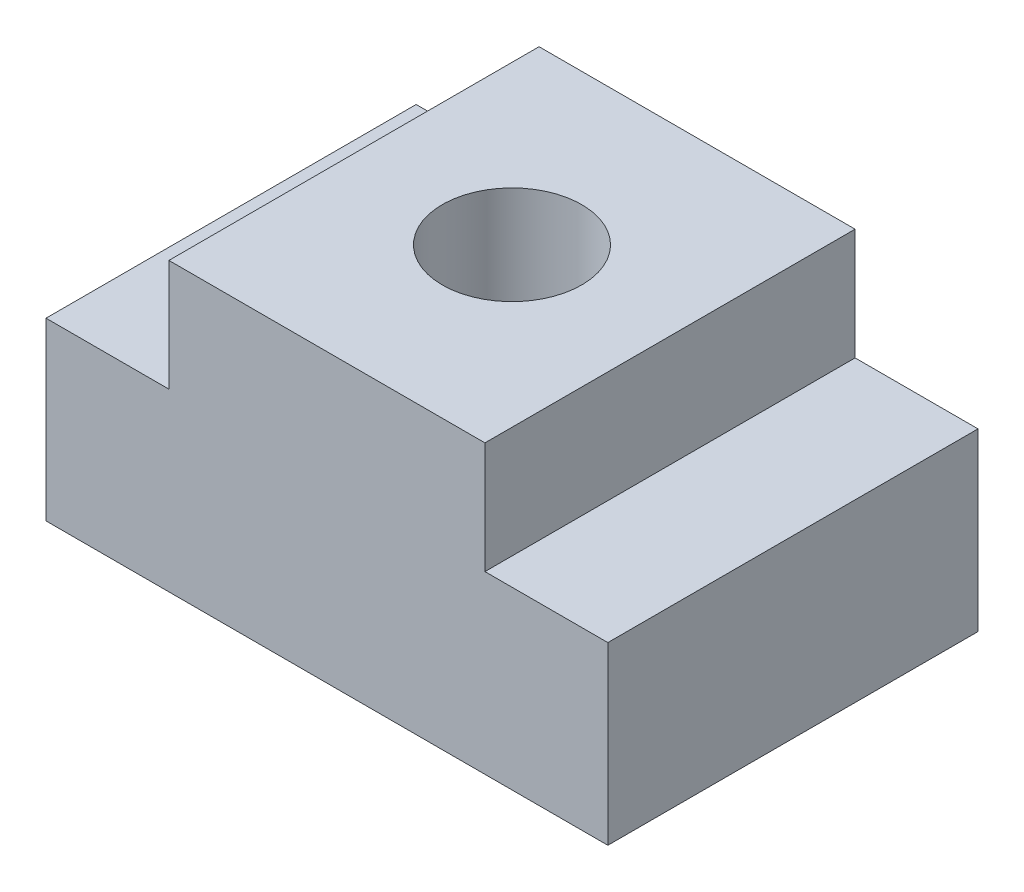
ISO-10303-21;
HEADER;
FILE_DESCRIPTION(('STEP AP214'),'2;1');
FILE_NAME('part.step','',(''),(''),'','','');
FILE_SCHEMA(('AUTOMOTIVE_DESIGN { 1 0 10303 214 1 1 1 1 }'));
ENDSEC;
DATA;
#1=APPLICATION_CONTEXT('core data for automotive mechanical design processes');
#2=APPLICATION_PROTOCOL_DEFINITION('international standard','automotive_design',2000,#1);
#3=PRODUCT_CONTEXT('',#1,'mechanical');
#4=PRODUCT('Part','Part','',(#3));
#5=PRODUCT_RELATED_PRODUCT_CATEGORY('part','',(#4));
#6=PRODUCT_DEFINITION_FORMATION('','',#4);
#7=PRODUCT_DEFINITION_CONTEXT('part definition',#1,'design');
#8=PRODUCT_DEFINITION('design','',#6,#7);
#9=PRODUCT_DEFINITION_SHAPE('','',#8);
#10=(LENGTH_UNIT() NAMED_UNIT(*) SI_UNIT(.MILLI.,.METRE.));
#11=(NAMED_UNIT(*) PLANE_ANGLE_UNIT() SI_UNIT($,.RADIAN.));
#12=(NAMED_UNIT(*) SI_UNIT($,.STERADIAN.) SOLID_ANGLE_UNIT());
#13=UNCERTAINTY_MEASURE_WITH_UNIT(LENGTH_MEASURE(1.E-05),#10,'distance_accuracy_value','');
#14=(GEOMETRIC_REPRESENTATION_CONTEXT(3) GLOBAL_UNCERTAINTY_ASSIGNED_CONTEXT((#13)) GLOBAL_UNIT_ASSIGNED_CONTEXT((#10,
#11,#12)) REPRESENTATION_CONTEXT('',''));
#15=CARTESIAN_POINT('',(0.,0.,0.));
#16=DIRECTION('',(0.,0.,1.));
#17=DIRECTION('',(1.,0.,0.));
#18=AXIS2_PLACEMENT_3D('',#15,#16,#17);
#19=CARTESIAN_POINT('',(-9.,10.,21.082));
#20=DIRECTION('',(1.,0.,0.));
#21=DIRECTION('',(0.,0.,-1.));
#22=AXIS2_PLACEMENT_3D('',#19,#20,#21);
#23=PLANE('',#22);
#24=DIRECTION('',(0.,-1.,0.));
#25=VECTOR('',#24,1.);
#26=CARTESIAN_POINT('',(-9.,10.,0.));
#27=LINE('',#26,#25);
#28=CARTESIAN_POINT('',(-9.,16.35,0.));
#29=VERTEX_POINT('',#28);
#30=CARTESIAN_POINT('',(-9.,10.,0.));
#31=VERTEX_POINT('',#30);
#32=EDGE_CURVE('E143',#29,#31,#27,.T.);
#33=ORIENTED_EDGE('',*,*,#32,.T.);
#34=DIRECTION('',(0.,0.,-1.));
#35=VECTOR('',#34,1.);
#36=CARTESIAN_POINT('',(-9.,10.,21.082));
#37=LINE('',#36,#35);
#38=CARTESIAN_POINT('',(-9.,10.,21.082));
#39=VERTEX_POINT('',#38);
#40=EDGE_CURVE('E11',#39,#31,#37,.T.);
#41=ORIENTED_EDGE('',*,*,#40,.F.);
#42=DIRECTION('',(0.,-1.,0.));
#43=VECTOR('',#42,1.);
#44=CARTESIAN_POINT('',(-9.,10.,21.082));
#45=LINE('',#44,#43);
#46=CARTESIAN_POINT('',(-9.,16.35,21.082));
#47=VERTEX_POINT('',#46);
#48=EDGE_CURVE('E158',#47,#39,#45,.T.);
#49=ORIENTED_EDGE('',*,*,#48,.F.);
#50=DIRECTION('',(0.,0.,-1.));
#51=VECTOR('',#50,1.);
#52=CARTESIAN_POINT('',(-9.,16.35,21.082));
#53=LINE('',#52,#51);
#54=EDGE_CURVE('E139',#47,#29,#53,.T.);
#55=ORIENTED_EDGE('',*,*,#54,.T.);
#56=EDGE_LOOP('',(#33,#41,#49,#55));
#57=FACE_BOUND('',#56,.T.);
#58=ADVANCED_FACE('F47',(#57),#23,.F.);
#59=CARTESIAN_POINT('',(-16.,10.,21.082));
#60=DIRECTION('',(0.,-1.,0.));
#61=DIRECTION('',(0.,0.,-1.));
#62=AXIS2_PLACEMENT_3D('',#59,#60,#61);
#63=PLANE('',#62);
#64=DIRECTION('',(-1.,0.,0.));
#65=VECTOR('',#64,1.);
#66=CARTESIAN_POINT('',(-16.,10.,0.));
#67=LINE('',#66,#65);
#68=CARTESIAN_POINT('',(-16.,10.,0.));
#69=VERTEX_POINT('',#68);
#70=EDGE_CURVE('E146',#31,#69,#67,.T.);
#71=ORIENTED_EDGE('',*,*,#70,.T.);
#72=DIRECTION('',(0.,0.,-1.));
#73=VECTOR('',#72,1.);
#74=CARTESIAN_POINT('',(-16.,10.,21.082));
#75=LINE('',#74,#73);
#76=CARTESIAN_POINT('',(-16.,10.,21.082));
#77=VERTEX_POINT('',#76);
#78=EDGE_CURVE('E55',#77,#69,#75,.T.);
#79=ORIENTED_EDGE('',*,*,#78,.F.);
#80=DIRECTION('',(-1.,0.,0.));
#81=VECTOR('',#80,1.);
#82=CARTESIAN_POINT('',(-16.,10.,21.082));
#83=LINE('',#82,#81);
#84=EDGE_CURVE('E106',#39,#77,#83,.T.);
#85=ORIENTED_EDGE('',*,*,#84,.F.);
#86=ORIENTED_EDGE('',*,*,#40,.T.);
#87=EDGE_LOOP('',(#71,#79,#85,#86));
#88=FACE_BOUND('',#87,.T.);
#89=ADVANCED_FACE('F212',(#88),#63,.F.);
#90=CARTESIAN_POINT('',(-16.,0.,21.082));
#91=DIRECTION('',(1.,0.,0.));
#92=DIRECTION('',(0.,0.,-1.));
#93=AXIS2_PLACEMENT_3D('',#90,#91,#92);
#94=PLANE('',#93);
#95=DIRECTION('',(0.,-1.,0.));
#96=VECTOR('',#95,1.);
#97=CARTESIAN_POINT('',(-16.,0.,0.));
#98=LINE('',#97,#96);
#99=CARTESIAN_POINT('',(-16.,0.,0.));
#100=VERTEX_POINT('',#99);
#101=EDGE_CURVE('E149',#69,#100,#98,.T.);
#102=ORIENTED_EDGE('',*,*,#101,.T.);
#103=DIRECTION('',(0.,0.,-1.));
#104=VECTOR('',#103,1.);
#105=CARTESIAN_POINT('',(-16.,0.,21.082));
#106=LINE('',#105,#104);
#107=CARTESIAN_POINT('',(-16.,0.,21.082));
#108=VERTEX_POINT('',#107);
#109=EDGE_CURVE('E165',#108,#100,#106,.T.);
#110=ORIENTED_EDGE('',*,*,#109,.F.);
#111=DIRECTION('',(0.,-1.,0.));
#112=VECTOR('',#111,1.);
#113=CARTESIAN_POINT('',(-16.,0.,21.082));
#114=LINE('',#113,#112);
#115=EDGE_CURVE('E173',#77,#108,#114,.T.);
#116=ORIENTED_EDGE('',*,*,#115,.F.);
#117=ORIENTED_EDGE('',*,*,#78,.T.);
#118=EDGE_LOOP('',(#102,#110,#116,#117));
#119=FACE_BOUND('',#118,.T.);
#120=ADVANCED_FACE('F171',(#119),#94,.F.);
#121=CARTESIAN_POINT('',(-16.,0.,21.082));
#122=DIRECTION('',(0.,1.,0.));
#123=DIRECTION('',(-1.,0.,0.));
#124=AXIS2_PLACEMENT_3D('',#121,#122,#123);
#125=PLANE('',#124);
#126=CARTESIAN_POINT('',(0.,0.,10.541));
#127=DIRECTION('',(0.,1.,0.));
#128=DIRECTION('',(0.,0.,1.));
#129=AXIS2_PLACEMENT_3D('',#126,#127,#128);
#130=CIRCLE('',#129,3.96875);
#131=CARTESIAN_POINT('',(0.,0.,14.50975));
#132=VERTEX_POINT('',#131);
#133=EDGE_CURVE('E147',#132,#132,#130,.T.);
#134=ORIENTED_EDGE('',*,*,#133,.T.);
#135=EDGE_LOOP('',(#134));
#136=FACE_BOUND('',#135,.T.);
#137=DIRECTION('',(1.,0.,0.));
#138=VECTOR('',#137,1.);
#139=CARTESIAN_POINT('',(-16.,0.,0.));
#140=LINE('',#139,#138);
#141=CARTESIAN_POINT('',(16.,0.,0.));
#142=VERTEX_POINT('',#141);
#143=EDGE_CURVE('E151',#100,#142,#140,.T.);
#144=ORIENTED_EDGE('',*,*,#143,.T.);
#145=DIRECTION('',(0.,0.,-1.));
#146=VECTOR('',#145,1.);
#147=CARTESIAN_POINT('',(16.,0.,21.082));
#148=LINE('',#147,#146);
#149=CARTESIAN_POINT('',(16.,0.,21.082));
#150=VERTEX_POINT('',#149);
#151=EDGE_CURVE('E162',#150,#142,#148,.T.);
#152=ORIENTED_EDGE('',*,*,#151,.F.);
#153=DIRECTION('',(1.,0.,0.));
#154=VECTOR('',#153,1.);
#155=CARTESIAN_POINT('',(-16.,0.,21.082));
#156=LINE('',#155,#154);
#157=EDGE_CURVE('E185',#108,#150,#156,.T.);
#158=ORIENTED_EDGE('',*,*,#157,.F.);
#159=ORIENTED_EDGE('',*,*,#109,.T.);
#160=EDGE_LOOP('',(#144,#152,#158,#159));
#161=FACE_BOUND('',#160,.T.);
#162=ADVANCED_FACE('F181',(#136,#161),#125,.F.);
#163=CARTESIAN_POINT('',(16.,0.,21.082));
#164=DIRECTION('',(-1.,0.,0.));
#165=DIRECTION('',(0.,0.,1.));
#166=AXIS2_PLACEMENT_3D('',#163,#164,#165);
#167=PLANE('',#166);
#168=DIRECTION('',(0.,1.,0.));
#169=VECTOR('',#168,1.);
#170=CARTESIAN_POINT('',(16.,0.,0.));
#171=LINE('',#170,#169);
#172=CARTESIAN_POINT('',(16.,10.,0.));
#173=VERTEX_POINT('',#172);
#174=EDGE_CURVE('E153',#142,#173,#171,.T.);
#175=ORIENTED_EDGE('',*,*,#174,.T.);
#176=DIRECTION('',(0.,0.,-1.));
#177=VECTOR('',#176,1.);
#178=CARTESIAN_POINT('',(16.,10.,21.082));
#179=LINE('',#178,#177);
#180=CARTESIAN_POINT('',(16.,10.,21.082));
#181=VERTEX_POINT('',#180);
#182=EDGE_CURVE('E134',#181,#173,#179,.T.);
#183=ORIENTED_EDGE('',*,*,#182,.F.);
#184=DIRECTION('',(0.,1.,0.));
#185=VECTOR('',#184,1.);
#186=CARTESIAN_POINT('',(16.,0.,21.082));
#187=LINE('',#186,#185);
#188=EDGE_CURVE('E125',#150,#181,#187,.T.);
#189=ORIENTED_EDGE('',*,*,#188,.F.);
#190=ORIENTED_EDGE('',*,*,#151,.T.);
#191=EDGE_LOOP('',(#175,#183,#189,#190));
#192=FACE_BOUND('',#191,.T.);
#193=ADVANCED_FACE('F184',(#192),#167,.F.);
#194=CARTESIAN_POINT('',(16.,10.,21.082));
#195=DIRECTION('',(0.,-1.,0.));
#196=DIRECTION('',(1.,0.,0.));
#197=AXIS2_PLACEMENT_3D('',#194,#195,#196);
#198=PLANE('',#197);
#199=DIRECTION('',(-1.,0.,0.));
#200=VECTOR('',#199,1.);
#201=CARTESIAN_POINT('',(16.,10.,0.));
#202=LINE('',#201,#200);
#203=CARTESIAN_POINT('',(9.,10.,0.));
#204=VERTEX_POINT('',#203);
#205=EDGE_CURVE('E133',#173,#204,#202,.T.);
#206=ORIENTED_EDGE('',*,*,#205,.T.);
#207=DIRECTION('',(0.,0.,-1.));
#208=VECTOR('',#207,1.);
#209=CARTESIAN_POINT('',(9.,10.,21.082));
#210=LINE('',#209,#208);
#211=CARTESIAN_POINT('',(9.,10.,21.082));
#212=VERTEX_POINT('',#211);
#213=EDGE_CURVE('E130',#212,#204,#210,.T.);
#214=ORIENTED_EDGE('',*,*,#213,.F.);
#215=DIRECTION('',(-1.,0.,0.));
#216=VECTOR('',#215,1.);
#217=CARTESIAN_POINT('',(16.,10.,21.082));
#218=LINE('',#217,#216);
#219=EDGE_CURVE('E119',#181,#212,#218,.T.);
#220=ORIENTED_EDGE('',*,*,#219,.F.);
#221=ORIENTED_EDGE('',*,*,#182,.T.);
#222=EDGE_LOOP('',(#206,#214,#220,#221));
#223=FACE_BOUND('',#222,.T.);
#224=ADVANCED_FACE('F131',(#223),#198,.F.);
#225=CARTESIAN_POINT('',(9.,10.,21.082));
#226=DIRECTION('',(-1.,0.,0.));
#227=DIRECTION('',(0.,0.,1.));
#228=AXIS2_PLACEMENT_3D('',#225,#226,#227);
#229=PLANE('',#228);
#230=DIRECTION('',(0.,1.,0.));
#231=VECTOR('',#230,1.);
#232=CARTESIAN_POINT('',(9.,10.,0.));
#233=LINE('',#232,#231);
#234=CARTESIAN_POINT('',(9.,16.35,0.));
#235=VERTEX_POINT('',#234);
#236=EDGE_CURVE('E92',#204,#235,#233,.T.);
#237=ORIENTED_EDGE('',*,*,#236,.T.);
#238=DIRECTION('',(0.,0.,-1.));
#239=VECTOR('',#238,1.);
#240=CARTESIAN_POINT('',(9.,16.35,21.082));
#241=LINE('',#240,#239);
#242=CARTESIAN_POINT('',(9.,16.35,21.082));
#243=VERTEX_POINT('',#242);
#244=EDGE_CURVE('E135',#243,#235,#241,.T.);
#245=ORIENTED_EDGE('',*,*,#244,.F.);
#246=DIRECTION('',(0.,1.,0.));
#247=VECTOR('',#246,1.);
#248=CARTESIAN_POINT('',(9.,10.,21.082));
#249=LINE('',#248,#247);
#250=EDGE_CURVE('E123',#212,#243,#249,.T.);
#251=ORIENTED_EDGE('',*,*,#250,.F.);
#252=ORIENTED_EDGE('',*,*,#213,.T.);
#253=EDGE_LOOP('',(#237,#245,#251,#252));
#254=FACE_BOUND('',#253,.T.);
#255=ADVANCED_FACE('F137',(#254),#229,.F.);
#256=CARTESIAN_POINT('',(-9.,16.35,21.082));
#257=DIRECTION('',(0.,-1.,0.));
#258=DIRECTION('',(1.,0.,0.));
#259=AXIS2_PLACEMENT_3D('',#256,#257,#258);
#260=PLANE('',#259);
#261=CARTESIAN_POINT('',(0.,16.35,10.541));
#262=DIRECTION('',(0.,1.,0.));
#263=DIRECTION('',(0.,0.,1.));
#264=AXIS2_PLACEMENT_3D('',#261,#262,#263);
#265=CIRCLE('',#264,3.96874999999999);
#266=CARTESIAN_POINT('',(0.,16.35,14.50975));
#267=VERTEX_POINT('',#266);
#268=EDGE_CURVE('E193',#267,#267,#265,.T.);
#269=ORIENTED_EDGE('',*,*,#268,.F.);
#270=EDGE_LOOP('',(#269));
#271=FACE_BOUND('',#270,.T.);
#272=DIRECTION('',(-1.,0.,0.));
#273=VECTOR('',#272,1.);
#274=CARTESIAN_POINT('',(-9.,16.35,0.));
#275=LINE('',#274,#273);
#276=EDGE_CURVE('E98',#235,#29,#275,.T.);
#277=ORIENTED_EDGE('',*,*,#276,.T.);
#278=ORIENTED_EDGE('',*,*,#54,.F.);
#279=DIRECTION('',(-1.,0.,0.));
#280=VECTOR('',#279,1.);
#281=CARTESIAN_POINT('',(-9.,16.35,21.082));
#282=LINE('',#281,#280);
#283=EDGE_CURVE('E63',#243,#47,#282,.T.);
#284=ORIENTED_EDGE('',*,*,#283,.F.);
#285=ORIENTED_EDGE('',*,*,#244,.T.);
#286=EDGE_LOOP('',(#277,#278,#284,#285));
#287=FACE_BOUND('',#286,.T.);
#288=ADVANCED_FACE('F199',(#271,#287),#260,.F.);
#289=CARTESIAN_POINT('',(0.,0.,21.082));
#290=DIRECTION('',(0.,0.,-1.));
#291=DIRECTION('',(-1.,0.,0.));
#292=AXIS2_PLACEMENT_3D('',#289,#290,#291);
#293=PLANE('',#292);
#294=ORIENTED_EDGE('',*,*,#48,.T.);
#295=ORIENTED_EDGE('',*,*,#84,.T.);
#296=ORIENTED_EDGE('',*,*,#115,.T.);
#297=ORIENTED_EDGE('',*,*,#157,.T.);
#298=ORIENTED_EDGE('',*,*,#188,.T.);
#299=ORIENTED_EDGE('',*,*,#219,.T.);
#300=ORIENTED_EDGE('',*,*,#250,.T.);
#301=ORIENTED_EDGE('',*,*,#283,.T.);
#302=EDGE_LOOP('',(#294,#295,#296,#297,#298,#299,#300,#301));
#303=FACE_BOUND('',#302,.T.);
#304=ADVANCED_FACE('F121',(#303),#293,.F.);
#305=CARTESIAN_POINT('',(0.,0.,0.));
#306=DIRECTION('',(0.,0.,-1.));
#307=DIRECTION('',(-1.,0.,0.));
#308=AXIS2_PLACEMENT_3D('',#305,#306,#307);
#309=PLANE('',#308);
#310=ORIENTED_EDGE('',*,*,#32,.F.);
#311=ORIENTED_EDGE('',*,*,#276,.F.);
#312=ORIENTED_EDGE('',*,*,#236,.F.);
#313=ORIENTED_EDGE('',*,*,#205,.F.);
#314=ORIENTED_EDGE('',*,*,#174,.F.);
#315=ORIENTED_EDGE('',*,*,#143,.F.);
#316=ORIENTED_EDGE('',*,*,#101,.F.);
#317=ORIENTED_EDGE('',*,*,#70,.F.);
#318=EDGE_LOOP('',(#310,#311,#312,#313,#314,#315,#316,#317));
#319=FACE_BOUND('',#318,.T.);
#320=ADVANCED_FACE('F177',(#319),#309,.T.);
#321=CARTESIAN_POINT('',(0.,16.35,10.541));
#322=DIRECTION('',(0.,1.,0.));
#323=DIRECTION('',(0.,0.,1.));
#324=AXIS2_PLACEMENT_3D('',#321,#322,#323);
#325=CYLINDRICAL_SURFACE('',#324,3.96874999999999);
#326=ORIENTED_EDGE('',*,*,#133,.F.);
#327=EDGE_LOOP('',(#326));
#328=FACE_BOUND('',#327,.T.);
#329=ORIENTED_EDGE('',*,*,#268,.T.);
#330=EDGE_LOOP('',(#329));
#331=FACE_BOUND('',#330,.T.);
#332=ADVANCED_FACE('F197',(#328,#331),#325,.F.);
#333=CLOSED_SHELL('',(#58,#89,#120,#162,#193,#224,#255,#288,#304,#320,#332));
#334=MANIFOLD_SOLID_BREP('B2',#333);
#335=ADVANCED_BREP_SHAPE_REPRESENTATION('',(#18,#334),#14);
#336=SHAPE_DEFINITION_REPRESENTATION(#9,#335);
ENDSEC;
END-ISO-10303-21;
